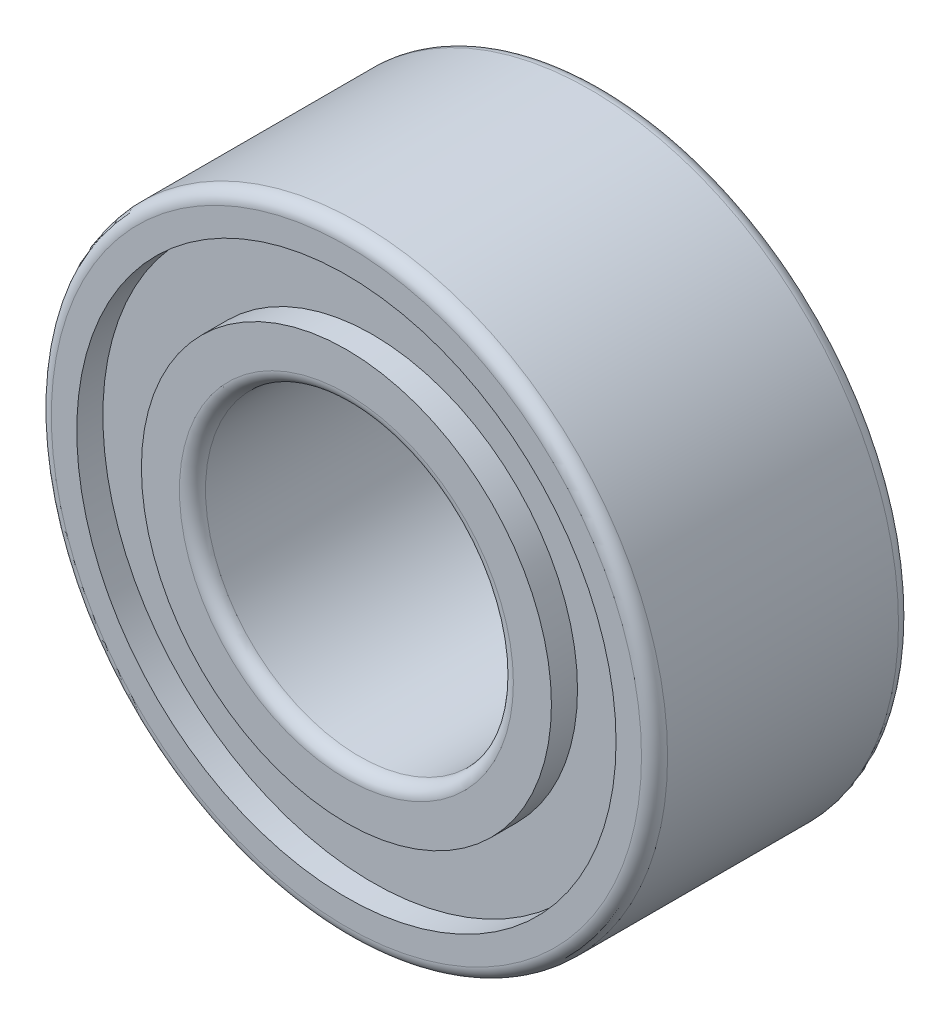
ISO-10303-21;
HEADER;
FILE_DESCRIPTION(('STEP AP214'),'2;1');
FILE_NAME('part.step','',(''),(''),'','','');
FILE_SCHEMA(('AUTOMOTIVE_DESIGN { 1 0 10303 214 1 1 1 1 }'));
ENDSEC;
DATA;
#1=APPLICATION_CONTEXT('core data for automotive mechanical design processes');
#2=APPLICATION_PROTOCOL_DEFINITION('international standard','automotive_design',2000,#1);
#3=PRODUCT_CONTEXT('',#1,'mechanical');
#4=PRODUCT('Part','Part','',(#3));
#5=PRODUCT_RELATED_PRODUCT_CATEGORY('part','',(#4));
#6=PRODUCT_DEFINITION_FORMATION('','',#4);
#7=PRODUCT_DEFINITION_CONTEXT('part definition',#1,'design');
#8=PRODUCT_DEFINITION('design','',#6,#7);
#9=PRODUCT_DEFINITION_SHAPE('','',#8);
#10=(LENGTH_UNIT() NAMED_UNIT(*) SI_UNIT(.MILLI.,.METRE.));
#11=(NAMED_UNIT(*) PLANE_ANGLE_UNIT() SI_UNIT($,.RADIAN.));
#12=(NAMED_UNIT(*) SI_UNIT($,.STERADIAN.) SOLID_ANGLE_UNIT());
#13=UNCERTAINTY_MEASURE_WITH_UNIT(LENGTH_MEASURE(1.E-05),#10,'distance_accuracy_value','');
#14=(GEOMETRIC_REPRESENTATION_CONTEXT(3) GLOBAL_UNCERTAINTY_ASSIGNED_CONTEXT((#13)) GLOBAL_UNIT_ASSIGNED_CONTEXT((#10,
#11,#12)) REPRESENTATION_CONTEXT('',''));
#15=CARTESIAN_POINT('',(0.,0.,0.));
#16=DIRECTION('',(0.,0.,1.));
#17=DIRECTION('',(1.,0.,0.));
#18=AXIS2_PLACEMENT_3D('',#15,#16,#17);
#19=CARTESIAN_POINT('',(0.,0.,0.));
#20=DIRECTION('',(0.,0.,1.));
#21=DIRECTION('',(1.,0.,0.));
#22=AXIS2_PLACEMENT_3D('',#19,#20,#21);
#23=PLANE('',#22);
#24=CARTESIAN_POINT('',(0.,0.,0.));
#25=DIRECTION('',(0.,0.,1.));
#26=DIRECTION('',(1.,0.,0.));
#27=AXIS2_PLACEMENT_3D('',#24,#25,#26);
#28=CIRCLE('',#27,1.6256);
#29=CARTESIAN_POINT('',(1.6256,0.,0.));
#30=VERTEX_POINT('',#29);
#31=EDGE_CURVE('E62',#30,#30,#28,.T.);
#32=ORIENTED_EDGE('',*,*,#31,.T.);
#33=EDGE_LOOP('',(#32));
#34=FACE_BOUND('',#33,.T.);
#35=CARTESIAN_POINT('',(0.,0.,0.));
#36=DIRECTION('',(0.,0.,-1.));
#37=DIRECTION('',(-1.,0.,0.));
#38=AXIS2_PLACEMENT_3D('',#35,#36,#37);
#39=CIRCLE('',#38,1.9939);
#40=CARTESIAN_POINT('',(-1.9939,0.,0.));
#41=VERTEX_POINT('',#40);
#42=EDGE_CURVE('E92',#41,#41,#39,.T.);
#43=ORIENTED_EDGE('',*,*,#42,.T.);
#44=EDGE_LOOP('',(#43));
#45=FACE_BOUND('',#44,.T.);
#46=ADVANCED_FACE('F39',(#34,#45),#23,.F.);
#47=CARTESIAN_POINT('',(0.,0.,2.5019));
#48=DIRECTION('',(0.,0.,1.));
#49=DIRECTION('',(1.,0.,0.));
#50=AXIS2_PLACEMENT_3D('',#47,#48,#49);
#51=PLANE('',#50);
#52=CARTESIAN_POINT('',(0.,0.,2.5019));
#53=DIRECTION('',(0.,0.,1.));
#54=DIRECTION('',(1.,0.,0.));
#55=AXIS2_PLACEMENT_3D('',#52,#53,#54);
#56=CIRCLE('',#55,1.6256);
#57=CARTESIAN_POINT('',(1.6256,0.,2.5019));
#58=VERTEX_POINT('',#57);
#59=EDGE_CURVE('E10',#58,#58,#56,.F.);
#60=ORIENTED_EDGE('',*,*,#59,.T.);
#61=EDGE_LOOP('',(#60));
#62=FACE_BOUND('',#61,.T.);
#63=CARTESIAN_POINT('',(0.,0.,2.5019));
#64=DIRECTION('',(0.,0.,1.));
#65=DIRECTION('',(1.,0.,0.));
#66=AXIS2_PLACEMENT_3D('',#63,#64,#65);
#67=CIRCLE('',#66,1.99585199);
#68=CARTESIAN_POINT('',(1.99585199,0.,2.5019));
#69=VERTEX_POINT('',#68);
#70=EDGE_CURVE('E80',#69,#69,#67,.T.);
#71=ORIENTED_EDGE('',*,*,#70,.T.);
#72=EDGE_LOOP('',(#71));
#73=FACE_BOUND('',#72,.T.);
#74=ADVANCED_FACE('F109',(#62,#73),#51,.T.);
#75=CARTESIAN_POINT('',(0.,0.,2.5019));
#76=DIRECTION('',(0.,0.,1.));
#77=DIRECTION('',(1.,0.,0.));
#78=AXIS2_PLACEMENT_3D('',#75,#76,#77);
#79=CIRCLE('',#78,2.62507869411481);
#80=CARTESIAN_POINT('',(2.62507869411481,0.,2.5019));
#81=VERTEX_POINT('',#80);
#82=EDGE_CURVE('E74',#81,#81,#79,.T.);
#83=ORIENTED_EDGE('',*,*,#82,.F.);
#84=EDGE_LOOP('',(#83));
#85=FACE_BOUND('',#84,.T.);
#86=CARTESIAN_POINT('',(0.,0.,2.5019));
#87=DIRECTION('',(0.,0.,1.));
#88=DIRECTION('',(1.,0.,0.));
#89=AXIS2_PLACEMENT_3D('',#86,#87,#88);
#90=CIRCLE('',#89,2.87274);
#91=CARTESIAN_POINT('',(2.87274,0.,2.5019));
#92=VERTEX_POINT('',#91);
#93=EDGE_CURVE('E46',#92,#92,#90,.T.);
#94=ORIENTED_EDGE('',*,*,#93,.T.);
#95=EDGE_LOOP('',(#94));
#96=FACE_BOUND('',#95,.T.);
#97=ADVANCED_FACE('F116',(#85,#96),#51,.T.);
#98=CARTESIAN_POINT('',(0.,0.,0.));
#99=DIRECTION('',(0.,0.,-1.));
#100=DIRECTION('',(-1.,0.,0.));
#101=AXIS2_PLACEMENT_3D('',#98,#99,#100);
#102=CIRCLE('',#101,2.62509);
#103=CARTESIAN_POINT('',(-2.62509,0.,0.));
#104=VERTEX_POINT('',#103);
#105=EDGE_CURVE('E86',#104,#104,#102,.T.);
#106=ORIENTED_EDGE('',*,*,#105,.F.);
#107=EDGE_LOOP('',(#106));
#108=FACE_BOUND('',#107,.T.);
#109=CARTESIAN_POINT('',(0.,0.,0.));
#110=DIRECTION('',(0.,0.,1.));
#111=DIRECTION('',(1.,0.,0.));
#112=AXIS2_PLACEMENT_3D('',#109,#110,#111);
#113=CIRCLE('',#112,2.87274);
#114=CARTESIAN_POINT('',(2.87274,0.,0.));
#115=VERTEX_POINT('',#114);
#116=EDGE_CURVE('E59',#115,#115,#113,.F.);
#117=ORIENTED_EDGE('',*,*,#116,.T.);
#118=EDGE_LOOP('',(#117));
#119=FACE_BOUND('',#118,.T.);
#120=ADVANCED_FACE('F112',(#108,#119),#23,.F.);
#121=CARTESIAN_POINT('',(0.,0.,2.5019));
#122=DIRECTION('',(0.,0.,-1.));
#123=DIRECTION('',(-1.,0.,0.));
#124=AXIS2_PLACEMENT_3D('',#121,#122,#123);
#125=CYLINDRICAL_SURFACE('',#124,2.99974);
#126=CARTESIAN_POINT('',(0.,0.,0.127000000000002));
#127=DIRECTION('',(0.,0.,1.));
#128=DIRECTION('',(1.,0.,0.));
#129=AXIS2_PLACEMENT_3D('',#126,#127,#128);
#130=CIRCLE('',#129,2.99974);
#131=CARTESIAN_POINT('',(2.99974,0.,0.127000000000002));
#132=VERTEX_POINT('',#131);
#133=EDGE_CURVE('E65',#132,#132,#130,.T.);
#134=ORIENTED_EDGE('',*,*,#133,.T.);
#135=EDGE_LOOP('',(#134));
#136=FACE_BOUND('',#135,.T.);
#137=CARTESIAN_POINT('',(0.,0.,2.3749));
#138=DIRECTION('',(0.,0.,1.));
#139=DIRECTION('',(1.,0.,0.));
#140=AXIS2_PLACEMENT_3D('',#137,#138,#139);
#141=CIRCLE('',#140,2.99974);
#142=CARTESIAN_POINT('',(2.99974,0.,2.3749));
#143=VERTEX_POINT('',#142);
#144=EDGE_CURVE('E68',#143,#143,#141,.F.);
#145=ORIENTED_EDGE('',*,*,#144,.T.);
#146=EDGE_LOOP('',(#145));
#147=FACE_BOUND('',#146,.T.);
#148=ADVANCED_FACE('F41',(#136,#147),#125,.T.);
#149=CARTESIAN_POINT('',(0.,0.,2.5019));
#150=DIRECTION('',(0.,0.,-1.));
#151=DIRECTION('',(-1.,0.,0.));
#152=AXIS2_PLACEMENT_3D('',#149,#150,#151);
#153=CYLINDRICAL_SURFACE('',#152,1.4986);
#154=CARTESIAN_POINT('',(0.,0.,0.127000000000002));
#155=DIRECTION('',(0.,0.,1.));
#156=DIRECTION('',(1.,0.,0.));
#157=AXIS2_PLACEMENT_3D('',#154,#155,#156);
#158=CIRCLE('',#157,1.4986);
#159=CARTESIAN_POINT('',(1.4986,0.,0.127000000000002));
#160=VERTEX_POINT('',#159);
#161=EDGE_CURVE('E50',#160,#160,#158,.F.);
#162=ORIENTED_EDGE('',*,*,#161,.T.);
#163=EDGE_LOOP('',(#162));
#164=FACE_BOUND('',#163,.T.);
#165=CARTESIAN_POINT('',(0.,0.,2.3749));
#166=DIRECTION('',(0.,0.,1.));
#167=DIRECTION('',(1.,0.,0.));
#168=AXIS2_PLACEMENT_3D('',#165,#166,#167);
#169=CIRCLE('',#168,1.4986);
#170=CARTESIAN_POINT('',(1.4986,0.,2.3749));
#171=VERTEX_POINT('',#170);
#172=EDGE_CURVE('E54',#171,#171,#169,.T.);
#173=ORIENTED_EDGE('',*,*,#172,.T.);
#174=EDGE_LOOP('',(#173));
#175=FACE_BOUND('',#174,.T.);
#176=ADVANCED_FACE('F124',(#164,#175),#153,.F.);
#177=CARTESIAN_POINT('',(0.,0.,0.127000000000002));
#178=DIRECTION('',(0.,0.,1.));
#179=DIRECTION('',(1.,0.,0.));
#180=AXIS2_PLACEMENT_3D('',#177,#178,#179);
#181=TOROIDAL_SURFACE('',#180,2.87274,0.127);
#182=ORIENTED_EDGE('',*,*,#116,.F.);
#183=EDGE_LOOP('',(#182));
#184=FACE_BOUND('',#183,.T.);
#185=ORIENTED_EDGE('',*,*,#133,.F.);
#186=EDGE_LOOP('',(#185));
#187=FACE_BOUND('',#186,.T.);
#188=ADVANCED_FACE('F131',(#184,#187),#181,.T.);
#189=CARTESIAN_POINT('',(0.,0.,0.127000000000002));
#190=DIRECTION('',(0.,0.,1.));
#191=DIRECTION('',(1.,0.,0.));
#192=AXIS2_PLACEMENT_3D('',#189,#190,#191);
#193=TOROIDAL_SURFACE('',#192,1.6256,0.127);
#194=ORIENTED_EDGE('',*,*,#161,.F.);
#195=EDGE_LOOP('',(#194));
#196=FACE_BOUND('',#195,.T.);
#197=ORIENTED_EDGE('',*,*,#31,.F.);
#198=EDGE_LOOP('',(#197));
#199=FACE_BOUND('',#198,.T.);
#200=ADVANCED_FACE('F134',(#196,#199),#193,.T.);
#201=CARTESIAN_POINT('',(0.,0.,2.3749));
#202=DIRECTION('',(0.,0.,1.));
#203=DIRECTION('',(1.,0.,0.));
#204=AXIS2_PLACEMENT_3D('',#201,#202,#203);
#205=TOROIDAL_SURFACE('',#204,1.6256,0.127);
#206=ORIENTED_EDGE('',*,*,#59,.F.);
#207=EDGE_LOOP('',(#206));
#208=FACE_BOUND('',#207,.T.);
#209=ORIENTED_EDGE('',*,*,#172,.F.);
#210=EDGE_LOOP('',(#209));
#211=FACE_BOUND('',#210,.T.);
#212=ADVANCED_FACE('F144',(#208,#211),#205,.T.);
#213=CARTESIAN_POINT('',(0.,0.,2.3749));
#214=DIRECTION('',(0.,0.,1.));
#215=DIRECTION('',(1.,0.,0.));
#216=AXIS2_PLACEMENT_3D('',#213,#214,#215);
#217=TOROIDAL_SURFACE('',#216,2.87274,0.127);
#218=ORIENTED_EDGE('',*,*,#144,.F.);
#219=EDGE_LOOP('',(#218));
#220=FACE_BOUND('',#219,.T.);
#221=ORIENTED_EDGE('',*,*,#93,.F.);
#222=EDGE_LOOP('',(#221));
#223=FACE_BOUND('',#222,.T.);
#224=ADVANCED_FACE('F140',(#220,#223),#217,.T.);
#225=CARTESIAN_POINT('',(0.,0.,2.2479));
#226=DIRECTION('',(0.,0.,1.));
#227=DIRECTION('',(1.,0.,0.));
#228=AXIS2_PLACEMENT_3D('',#225,#226,#227);
#229=CYLINDRICAL_SURFACE('',#228,2.62507869411481);
#230=CARTESIAN_POINT('',(0.,0.,2.2479));
#231=DIRECTION('',(0.,0.,1.));
#232=DIRECTION('',(1.,0.,0.));
#233=AXIS2_PLACEMENT_3D('',#230,#231,#232);
#234=CIRCLE('',#233,2.62507869411481);
#235=CARTESIAN_POINT('',(2.62507869411481,0.,2.2479));
#236=VERTEX_POINT('',#235);
#237=EDGE_CURVE('E71',#236,#236,#234,.T.);
#238=ORIENTED_EDGE('',*,*,#237,.F.);
#239=EDGE_LOOP('',(#238));
#240=FACE_BOUND('',#239,.T.);
#241=ORIENTED_EDGE('',*,*,#82,.T.);
#242=EDGE_LOOP('',(#241));
#243=FACE_BOUND('',#242,.T.);
#244=ADVANCED_FACE('F143',(#240,#243),#229,.F.);
#245=CARTESIAN_POINT('',(0.,0.,2.2479));
#246=DIRECTION('',(0.,0.,1.));
#247=DIRECTION('',(1.,0.,0.));
#248=AXIS2_PLACEMENT_3D('',#245,#246,#247);
#249=PLANE('',#248);
#250=CARTESIAN_POINT('',(0.,0.,2.2479));
#251=DIRECTION('',(0.,0.,1.));
#252=DIRECTION('',(1.,0.,0.));
#253=AXIS2_PLACEMENT_3D('',#250,#251,#252);
#254=CIRCLE('',#253,1.99585199);
#255=CARTESIAN_POINT('',(1.99585199,0.,2.2479));
#256=VERTEX_POINT('',#255);
#257=EDGE_CURVE('E77',#256,#256,#254,.T.);
#258=ORIENTED_EDGE('',*,*,#257,.F.);
#259=EDGE_LOOP('',(#258));
#260=FACE_BOUND('',#259,.T.);
#261=ORIENTED_EDGE('',*,*,#237,.T.);
#262=EDGE_LOOP('',(#261));
#263=FACE_BOUND('',#262,.T.);
#264=ADVANCED_FACE('F150',(#260,#263),#249,.T.);
#265=CARTESIAN_POINT('',(0.,0.,2.2479));
#266=DIRECTION('',(0.,0.,1.));
#267=DIRECTION('',(1.,0.,0.));
#268=AXIS2_PLACEMENT_3D('',#265,#266,#267);
#269=CYLINDRICAL_SURFACE('',#268,1.99585199);
#270=ORIENTED_EDGE('',*,*,#257,.T.);
#271=EDGE_LOOP('',(#270));
#272=FACE_BOUND('',#271,.T.);
#273=ORIENTED_EDGE('',*,*,#70,.F.);
#274=EDGE_LOOP('',(#273));
#275=FACE_BOUND('',#274,.T.);
#276=ADVANCED_FACE('F204',(#272,#275),#269,.T.);
#277=CARTESIAN_POINT('',(0.,0.,0.254000000000004));
#278=DIRECTION('',(0.,0.,-1.));
#279=DIRECTION('',(-1.,0.,0.));
#280=AXIS2_PLACEMENT_3D('',#277,#278,#279);
#281=CYLINDRICAL_SURFACE('',#280,2.62509);
#282=CARTESIAN_POINT('',(0.,0.,0.254000000000004));
#283=DIRECTION('',(0.,0.,-1.));
#284=DIRECTION('',(-1.,0.,0.));
#285=AXIS2_PLACEMENT_3D('',#282,#283,#284);
#286=CIRCLE('',#285,2.62509);
#287=CARTESIAN_POINT('',(-2.62509,0.,0.254000000000004));
#288=VERTEX_POINT('',#287);
#289=EDGE_CURVE('E83',#288,#288,#286,.T.);
#290=ORIENTED_EDGE('',*,*,#289,.F.);
#291=EDGE_LOOP('',(#290));
#292=FACE_BOUND('',#291,.T.);
#293=ORIENTED_EDGE('',*,*,#105,.T.);
#294=EDGE_LOOP('',(#293));
#295=FACE_BOUND('',#294,.T.);
#296=ADVANCED_FACE('F105',(#292,#295),#281,.F.);
#297=CARTESIAN_POINT('',(0.,0.,0.254000000000004));
#298=DIRECTION('',(0.,0.,-1.));
#299=DIRECTION('',(-1.,0.,0.));
#300=AXIS2_PLACEMENT_3D('',#297,#298,#299);
#301=PLANE('',#300);
#302=CARTESIAN_POINT('',(0.,0.,0.254000000000004));
#303=DIRECTION('',(0.,0.,-1.));
#304=DIRECTION('',(-1.,0.,0.));
#305=AXIS2_PLACEMENT_3D('',#302,#303,#304);
#306=CIRCLE('',#305,1.9939);
#307=CARTESIAN_POINT('',(-1.9939,0.,0.254000000000004));
#308=VERTEX_POINT('',#307);
#309=EDGE_CURVE('E89',#308,#308,#306,.T.);
#310=ORIENTED_EDGE('',*,*,#309,.F.);
#311=EDGE_LOOP('',(#310));
#312=FACE_BOUND('',#311,.T.);
#313=ORIENTED_EDGE('',*,*,#289,.T.);
#314=EDGE_LOOP('',(#313));
#315=FACE_BOUND('',#314,.T.);
#316=ADVANCED_FACE('F99',(#312,#315),#301,.T.);
#317=CARTESIAN_POINT('',(0.,0.,0.254000000000004));
#318=DIRECTION('',(0.,0.,-1.));
#319=DIRECTION('',(-1.,0.,0.));
#320=AXIS2_PLACEMENT_3D('',#317,#318,#319);
#321=CYLINDRICAL_SURFACE('',#320,1.9939);
#322=ORIENTED_EDGE('',*,*,#309,.T.);
#323=EDGE_LOOP('',(#322));
#324=FACE_BOUND('',#323,.T.);
#325=ORIENTED_EDGE('',*,*,#42,.F.);
#326=EDGE_LOOP('',(#325));
#327=FACE_BOUND('',#326,.T.);
#328=ADVANCED_FACE('F97',(#324,#327),#321,.T.);
#329=CLOSED_SHELL('',(#46,#74,#97,#120,#148,#176,#188,#200,#212,#224,#244,#264,#276,#296,#316,#328));
#330=MANIFOLD_SOLID_BREP('B2',#329);
#331=ADVANCED_BREP_SHAPE_REPRESENTATION('',(#18,#330),#14);
#332=SHAPE_DEFINITION_REPRESENTATION(#9,#331);
ENDSEC;
END-ISO-10303-21;
